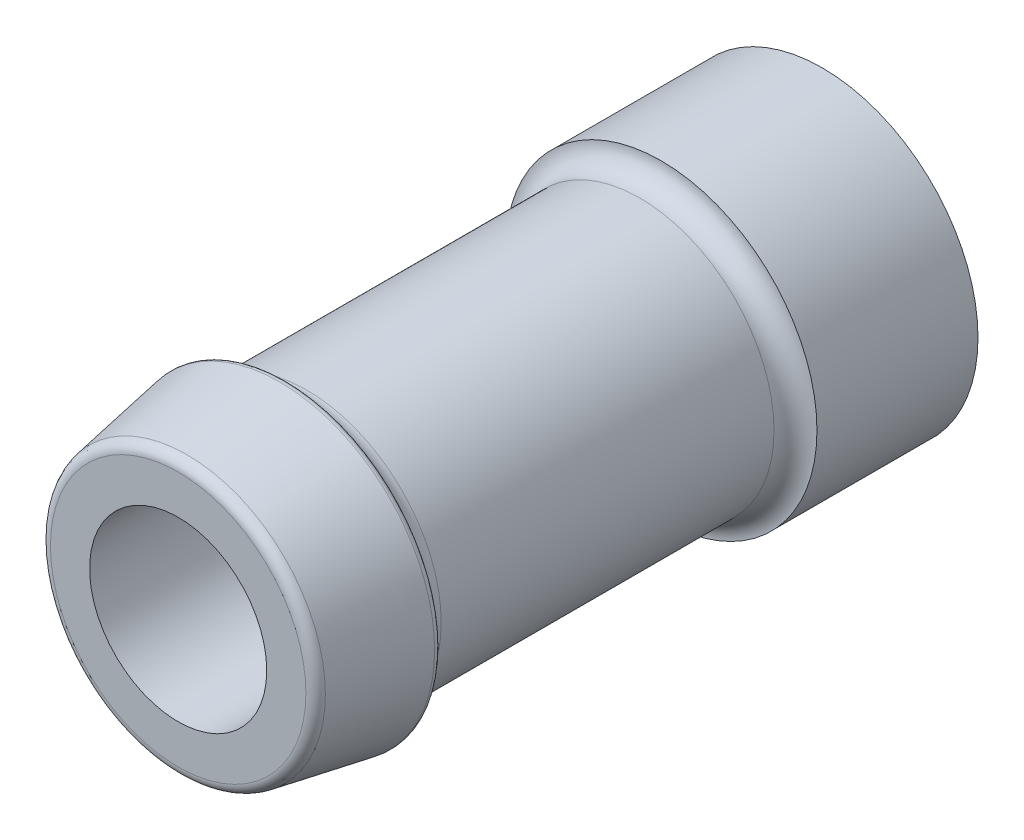
ISO-10303-21;
HEADER;
FILE_DESCRIPTION(('STEP AP214'),'2;1');
FILE_NAME('part.step','',(''),(''),'','','');
FILE_SCHEMA(('AUTOMOTIVE_DESIGN { 1 0 10303 214 1 1 1 1 }'));
ENDSEC;
DATA;
#1=APPLICATION_CONTEXT('core data for automotive mechanical design processes');
#2=APPLICATION_PROTOCOL_DEFINITION('international standard','automotive_design',2000,#1);
#3=PRODUCT_CONTEXT('',#1,'mechanical');
#4=PRODUCT('Part','Part','',(#3));
#5=PRODUCT_RELATED_PRODUCT_CATEGORY('part','',(#4));
#6=PRODUCT_DEFINITION_FORMATION('','',#4);
#7=PRODUCT_DEFINITION_CONTEXT('part definition',#1,'design');
#8=PRODUCT_DEFINITION('design','',#6,#7);
#9=PRODUCT_DEFINITION_SHAPE('','',#8);
#10=(LENGTH_UNIT() NAMED_UNIT(*) SI_UNIT(.MILLI.,.METRE.));
#11=(NAMED_UNIT(*) PLANE_ANGLE_UNIT() SI_UNIT($,.RADIAN.));
#12=(NAMED_UNIT(*) SI_UNIT($,.STERADIAN.) SOLID_ANGLE_UNIT());
#13=UNCERTAINTY_MEASURE_WITH_UNIT(LENGTH_MEASURE(1.E-05),#10,'distance_accuracy_value','');
#14=(GEOMETRIC_REPRESENTATION_CONTEXT(3) GLOBAL_UNCERTAINTY_ASSIGNED_CONTEXT((#13)) GLOBAL_UNIT_ASSIGNED_CONTEXT((#10,
#11,#12)) REPRESENTATION_CONTEXT('',''));
#15=CARTESIAN_POINT('',(0.,0.,0.));
#16=DIRECTION('',(0.,0.,1.));
#17=DIRECTION('',(1.,0.,0.));
#18=AXIS2_PLACEMENT_3D('',#15,#16,#17);
#19=CARTESIAN_POINT('',(0.,0.,30.48));
#20=DIRECTION('',(0.,0.,-1.));
#21=DIRECTION('',(-1.,0.,0.));
#22=AXIS2_PLACEMENT_3D('',#19,#20,#21);
#23=CYLINDRICAL_SURFACE('',#22,7.366);
#24=CARTESIAN_POINT('',(0.,0.,0.));
#25=DIRECTION('',(0.,0.,1.));
#26=DIRECTION('',(1.,0.,0.));
#27=AXIS2_PLACEMENT_3D('',#24,#25,#26);
#28=CIRCLE('',#27,7.366);
#29=CARTESIAN_POINT('',(-7.366,0.,0.));
#30=VERTEX_POINT('',#29);
#31=EDGE_CURVE('E71',#30,#30,#28,.T.);
#32=CARTESIAN_POINT('',(0.,0.,7.62));
#33=DIRECTION('',(0.,0.,1.));
#34=DIRECTION('',(1.,0.,0.));
#35=AXIS2_PLACEMENT_3D('',#32,#33,#34);
#36=CIRCLE('',#35,7.366);
#37=CARTESIAN_POINT('',(-7.366,0.,7.61999999999999));
#38=VERTEX_POINT('',#37);
#39=EDGE_CURVE('E72',#38,#38,#36,.T.);
#40=CARTESIAN_POINT('',(-7.366,0.,0.));
#41=CARTESIAN_POINT('',(-7.366,0.,0.0793749999999997));
#42=CARTESIAN_POINT('',(-7.366,0.,0.158749999999999));
#43=CARTESIAN_POINT('',(-7.366,0.,0.3175));
#44=CARTESIAN_POINT('',(-7.366,0.,0.396875));
#45=CARTESIAN_POINT('',(-7.366,0.,0.555625000000001));
#46=CARTESIAN_POINT('',(-7.366,0.,0.635));
#47=CARTESIAN_POINT('',(-7.366,0.,0.793749999999999));
#48=CARTESIAN_POINT('',(-7.366,0.,0.873124999999999));
#49=CARTESIAN_POINT('',(-7.366,0.,1.031875));
#50=CARTESIAN_POINT('',(-7.366,0.,1.11125));
#51=CARTESIAN_POINT('',(-7.366,0.,1.27));
#52=CARTESIAN_POINT('',(-7.366,0.,1.349375));
#53=CARTESIAN_POINT('',(-7.366,0.,1.508125));
#54=CARTESIAN_POINT('',(-7.366,0.,1.5875));
#55=CARTESIAN_POINT('',(-7.366,0.,1.74625));
#56=CARTESIAN_POINT('',(-7.366,0.,1.825625));
#57=CARTESIAN_POINT('',(-7.366,0.,1.984375));
#58=CARTESIAN_POINT('',(-7.366,0.,2.06375));
#59=CARTESIAN_POINT('',(-7.366,0.,2.2225));
#60=CARTESIAN_POINT('',(-7.366,0.,2.301875));
#61=CARTESIAN_POINT('',(-7.366,0.,2.460625));
#62=CARTESIAN_POINT('',(-7.366,0.,2.54));
#63=CARTESIAN_POINT('',(-7.366,0.,2.69875));
#64=CARTESIAN_POINT('',(-7.366,0.,2.778125));
#65=CARTESIAN_POINT('',(-7.366,0.,2.936875));
#66=CARTESIAN_POINT('',(-7.366,0.,3.01625));
#67=CARTESIAN_POINT('',(-7.366,0.,3.175));
#68=CARTESIAN_POINT('',(-7.366,0.,3.254375));
#69=CARTESIAN_POINT('',(-7.366,0.,3.413125));
#70=CARTESIAN_POINT('',(-7.366,0.,3.4925));
#71=CARTESIAN_POINT('',(-7.366,0.,3.65125));
#72=CARTESIAN_POINT('',(-7.366,0.,3.730625));
#73=CARTESIAN_POINT('',(-7.366,0.,3.889375));
#74=CARTESIAN_POINT('',(-7.366,0.,3.96875));
#75=CARTESIAN_POINT('',(-7.366,0.,4.1275));
#76=CARTESIAN_POINT('',(-7.366,0.,4.206875));
#77=CARTESIAN_POINT('',(-7.366,0.,4.365625));
#78=CARTESIAN_POINT('',(-7.366,0.,4.445));
#79=CARTESIAN_POINT('',(-7.366,0.,4.60375));
#80=CARTESIAN_POINT('',(-7.366,0.,4.683125));
#81=CARTESIAN_POINT('',(-7.366,0.,4.841875));
#82=CARTESIAN_POINT('',(-7.366,0.,4.92125));
#83=CARTESIAN_POINT('',(-7.366,0.,5.07999999999999));
#84=CARTESIAN_POINT('',(-7.366,0.,5.159375));
#85=CARTESIAN_POINT('',(-7.366,0.,5.318125));
#86=CARTESIAN_POINT('',(-7.366,0.,5.3975));
#87=CARTESIAN_POINT('',(-7.366,0.,5.55625));
#88=CARTESIAN_POINT('',(-7.366,0.,5.635625));
#89=CARTESIAN_POINT('',(-7.366,0.,5.794375));
#90=CARTESIAN_POINT('',(-7.366,0.,5.87375));
#91=CARTESIAN_POINT('',(-7.366,0.,6.0325));
#92=CARTESIAN_POINT('',(-7.366,0.,6.111875));
#93=CARTESIAN_POINT('',(-7.366,0.,6.27062499999999));
#94=CARTESIAN_POINT('',(-7.366,0.,6.34999999999999));
#95=CARTESIAN_POINT('',(-7.366,0.,6.50874999999999));
#96=CARTESIAN_POINT('',(-7.366,0.,6.588125));
#97=CARTESIAN_POINT('',(-7.366,0.,6.746875));
#98=CARTESIAN_POINT('',(-7.366,0.,6.82625));
#99=CARTESIAN_POINT('',(-7.366,0.,6.985));
#100=CARTESIAN_POINT('',(-7.366,0.,7.064375));
#101=CARTESIAN_POINT('',(-7.366,0.,7.223125));
#102=CARTESIAN_POINT('',(-7.366,0.,7.3025));
#103=CARTESIAN_POINT('',(-7.366,0.,7.46125));
#104=CARTESIAN_POINT('',(-7.366,0.,7.540625));
#105=CARTESIAN_POINT('',(-7.366,0.,7.61999999999999));
#106=B_SPLINE_CURVE_WITH_KNOTS('',3,(#40,#41,#42,#43,#44,#45,#46,#47,#48,#49,#50,#51,#52,#53,
#54,#55,#56,#57,#58,#59,#60,#61,#62,#63,#64,#65,#66,#67,#68,#69,#70,#71,#72,#73,#74,#75,#76,#77,
#78,#79,#80,#81,#82,#83,#84,#85,#86,#87,#88,#89,#90,#91,#92,#93,#94,#95,#96,#97,#98,#99,#100,
#101,#102,#103,#104,#105),.UNSPECIFIED.,.F.,.F.,(4,2,2,2,2,2,2,2,2,2,2,2,2,2,2,2,2,2,2,2,2,2,2,
2,2,2,2,2,2,2,2,2,4),(0.,0.238124999999999,0.476250000000001,0.714375,0.952499999999998,
1.190625,1.42875,1.666875,1.905,2.143125,2.38125,2.619375,2.8575,3.095625,3.33375,3.571875,3.81,
4.048125,4.28625,4.524375,4.7625,5.00062499999999,5.23875,5.476875,5.715,5.953125,6.19125,
6.42937499999999,6.6675,6.905625,7.14375,7.381875,7.61999999999999),.UNSPECIFIED.);
#107=EDGE_CURVE('BSEAM39',#30,#38,#106,.T.);
#108=ORIENTED_EDGE('',*,*,#31,.T.);
#109=ORIENTED_EDGE('',*,*,#39,.F.);
#110=ORIENTED_EDGE('',*,*,#107,.T.);
#111=ORIENTED_EDGE('',*,*,#107,.F.);
#112=EDGE_LOOP('',(#108,#110,#109,#111));
#113=FACE_BOUND('',#112,.T.);
#114=ADVANCED_FACE('F39',(#113),#23,.T.);
#115=CARTESIAN_POINT('',(0.,0.,30.48));
#116=DIRECTION('',(0.,0.,1.));
#117=DIRECTION('',(1.,0.,0.));
#118=AXIS2_PLACEMENT_3D('',#115,#116,#117);
#119=PLANE('',#118);
#120=CARTESIAN_POINT('',(0.,0.,30.48));
#121=DIRECTION('',(0.,0.,1.));
#122=DIRECTION('',(1.,0.,0.));
#123=AXIS2_PLACEMENT_3D('',#120,#121,#122);
#124=CIRCLE('',#123,6.04399632536298);
#125=CARTESIAN_POINT('',(6.04399632536298,0.,30.48));
#126=VERTEX_POINT('',#125);
#127=EDGE_CURVE('E57',#126,#126,#124,.T.);
#128=ORIENTED_EDGE('',*,*,#127,.T.);
#129=EDGE_LOOP('',(#128));
#130=FACE_BOUND('',#129,.T.);
#131=CARTESIAN_POINT('',(0.,0.,30.48));
#132=DIRECTION('',(0.,0.,1.));
#133=DIRECTION('',(1.,0.,0.));
#134=AXIS2_PLACEMENT_3D('',#131,#132,#133);
#135=CIRCLE('',#134,4.191);
#136=CARTESIAN_POINT('',(4.191,0.,30.48));
#137=VERTEX_POINT('',#136);
#138=EDGE_CURVE('E76',#137,#137,#135,.T.);
#139=ORIENTED_EDGE('',*,*,#138,.F.);
#140=EDGE_LOOP('',(#139));
#141=FACE_BOUND('',#140,.T.);
#142=ADVANCED_FACE('F98',(#130,#141),#119,.T.);
#143=CARTESIAN_POINT('',(0.,0.,0.));
#144=DIRECTION('',(0.,0.,1.));
#145=DIRECTION('',(1.,0.,0.));
#146=AXIS2_PLACEMENT_3D('',#143,#144,#145);
#147=PLANE('',#146);
#148=CARTESIAN_POINT('',(0.,0.,0.));
#149=DIRECTION('',(0.,0.,1.));
#150=DIRECTION('',(1.,0.,0.));
#151=AXIS2_PLACEMENT_3D('',#148,#149,#150);
#152=CIRCLE('',#151,4.191);
#153=CARTESIAN_POINT('',(4.191,0.,0.));
#154=VERTEX_POINT('',#153);
#155=EDGE_CURVE('E80',#154,#154,#152,.T.);
#156=ORIENTED_EDGE('',*,*,#155,.T.);
#157=EDGE_LOOP('',(#156));
#158=FACE_BOUND('',#157,.T.);
#159=ORIENTED_EDGE('',*,*,#31,.F.);
#160=EDGE_LOOP('',(#159));
#161=FACE_BOUND('',#160,.T.);
#162=ADVANCED_FACE('F88',(#158,#161),#147,.F.);
#163=CARTESIAN_POINT('',(0.,0.,0.));
#164=DIRECTION('',(0.,0.,1.));
#165=DIRECTION('',(1.,0.,0.));
#166=AXIS2_PLACEMENT_3D('',#163,#164,#165);
#167=CYLINDRICAL_SURFACE('',#166,4.191);
#168=CARTESIAN_POINT('',(4.191,0.,0.));
#169=CARTESIAN_POINT('',(4.191,0.,0.317499999999999));
#170=CARTESIAN_POINT('',(4.191,0.,0.635));
#171=CARTESIAN_POINT('',(4.191,0.,1.27));
#172=CARTESIAN_POINT('',(4.191,0.,1.5875));
#173=CARTESIAN_POINT('',(4.191,0.,2.2225));
#174=CARTESIAN_POINT('',(4.191,0.,2.54));
#175=CARTESIAN_POINT('',(4.191,0.,3.175));
#176=CARTESIAN_POINT('',(4.191,0.,3.4925));
#177=CARTESIAN_POINT('',(4.191,0.,4.1275));
#178=CARTESIAN_POINT('',(4.191,0.,4.445));
#179=CARTESIAN_POINT('',(4.191,0.,5.08));
#180=CARTESIAN_POINT('',(4.191,0.,5.3975));
#181=CARTESIAN_POINT('',(4.191,0.,6.0325));
#182=CARTESIAN_POINT('',(4.191,0.,6.35));
#183=CARTESIAN_POINT('',(4.191,0.,6.985));
#184=CARTESIAN_POINT('',(4.191,0.,7.3025));
#185=CARTESIAN_POINT('',(4.191,0.,7.9375));
#186=CARTESIAN_POINT('',(4.191,0.,8.255));
#187=CARTESIAN_POINT('',(4.191,0.,8.89));
#188=CARTESIAN_POINT('',(4.191,0.,9.2075));
#189=CARTESIAN_POINT('',(4.191,0.,9.8425));
#190=CARTESIAN_POINT('',(4.191,0.,10.16));
#191=CARTESIAN_POINT('',(4.191,0.,10.795));
#192=CARTESIAN_POINT('',(4.191,0.,11.1125));
#193=CARTESIAN_POINT('',(4.191,0.,11.7475));
#194=CARTESIAN_POINT('',(4.191,0.,12.065));
#195=CARTESIAN_POINT('',(4.191,0.,12.7));
#196=CARTESIAN_POINT('',(4.191,0.,13.0175));
#197=CARTESIAN_POINT('',(4.191,0.,13.6525));
#198=CARTESIAN_POINT('',(4.191,0.,13.97));
#199=CARTESIAN_POINT('',(4.191,0.,14.605));
#200=CARTESIAN_POINT('',(4.191,0.,14.9225));
#201=CARTESIAN_POINT('',(4.191,0.,15.5575));
#202=CARTESIAN_POINT('',(4.191,0.,15.875));
#203=CARTESIAN_POINT('',(4.191,0.,16.51));
#204=CARTESIAN_POINT('',(4.191,0.,16.8275));
#205=CARTESIAN_POINT('',(4.191,0.,17.4625));
#206=CARTESIAN_POINT('',(4.191,0.,17.78));
#207=CARTESIAN_POINT('',(4.191,0.,18.415));
#208=CARTESIAN_POINT('',(4.191,0.,18.7325));
#209=CARTESIAN_POINT('',(4.191,0.,19.3675));
#210=CARTESIAN_POINT('',(4.191,0.,19.685));
#211=CARTESIAN_POINT('',(4.191,0.,20.32));
#212=CARTESIAN_POINT('',(4.191,0.,20.6375));
#213=CARTESIAN_POINT('',(4.191,0.,21.2725));
#214=CARTESIAN_POINT('',(4.191,0.,21.59));
#215=CARTESIAN_POINT('',(4.191,0.,22.225));
#216=CARTESIAN_POINT('',(4.191,0.,22.5425));
#217=CARTESIAN_POINT('',(4.191,0.,23.1775));
#218=CARTESIAN_POINT('',(4.191,0.,23.495));
#219=CARTESIAN_POINT('',(4.191,0.,24.13));
#220=CARTESIAN_POINT('',(4.191,0.,24.4475));
#221=CARTESIAN_POINT('',(4.191,0.,25.0825));
#222=CARTESIAN_POINT('',(4.191,0.,25.4));
#223=CARTESIAN_POINT('',(4.191,0.,26.035));
#224=CARTESIAN_POINT('',(4.191,0.,26.3525));
#225=CARTESIAN_POINT('',(4.191,0.,26.9875));
#226=CARTESIAN_POINT('',(4.191,0.,27.305));
#227=CARTESIAN_POINT('',(4.191,0.,27.94));
#228=CARTESIAN_POINT('',(4.191,0.,28.2575));
#229=CARTESIAN_POINT('',(4.191,0.,28.8925));
#230=CARTESIAN_POINT('',(4.191,0.,29.21));
#231=CARTESIAN_POINT('',(4.191,0.,29.845));
#232=CARTESIAN_POINT('',(4.191,0.,30.1625));
#233=CARTESIAN_POINT('',(4.191,0.,30.48));
#234=B_SPLINE_CURVE_WITH_KNOTS('',3,(#168,#169,#170,#171,#172,#173,#174,#175,#176,#177,#178,
#179,#180,#181,#182,#183,#184,#185,#186,#187,#188,#189,#190,#191,#192,#193,#194,#195,#196,#197,
#198,#199,#200,#201,#202,#203,#204,#205,#206,#207,#208,#209,#210,#211,#212,#213,#214,#215,#216,
#217,#218,#219,#220,#221,#222,#223,#224,#225,#226,#227,#228,#229,#230,#231,#232,#233),
.UNSPECIFIED.,.F.,.F.,(4,2,2,2,2,2,2,2,2,2,2,2,2,2,2,2,2,2,2,2,2,2,2,2,2,2,2,2,2,2,2,2,4),(0.,
0.9525,1.905,2.8575,3.81,4.7625,5.715,6.6675,7.62,8.5725,9.525,10.4775,11.43,12.3825,13.335,
14.2875,15.24,16.1925,17.145,18.0975,19.05,20.0025,20.955,21.9075,22.86,23.8125,24.765,25.7175,
26.67,27.6225,28.575,29.5275,30.48),.UNSPECIFIED.);
#235=EDGE_CURVE('BSEAM91',#154,#137,#234,.T.);
#236=ORIENTED_EDGE('',*,*,#155,.F.);
#237=ORIENTED_EDGE('',*,*,#138,.T.);
#238=ORIENTED_EDGE('',*,*,#235,.T.);
#239=ORIENTED_EDGE('',*,*,#235,.F.);
#240=EDGE_LOOP('',(#236,#238,#237,#239));
#241=FACE_BOUND('',#240,.T.);
#242=ADVANCED_FACE('F91',(#241),#167,.F.);
#243=CARTESIAN_POINT('',(0.,0.,7.62));
#244=DIRECTION('',(0.,0.,1.));
#245=DIRECTION('',(1.,0.,0.));
#246=AXIS2_PLACEMENT_3D('',#243,#244,#245);
#247=CYLINDRICAL_SURFACE('',#246,6.35);
#248=CARTESIAN_POINT('',(0.,0.,24.384));
#249=DIRECTION('',(0.,0.,1.));
#250=DIRECTION('',(1.,0.,0.));
#251=AXIS2_PLACEMENT_3D('',#248,#249,#250);
#252=CIRCLE('',#251,6.35);
#253=CARTESIAN_POINT('',(6.35,0.,24.384));
#254=VERTEX_POINT('',#253);
#255=EDGE_CURVE('E63',#254,#254,#252,.F.);
#256=ORIENTED_EDGE('',*,*,#255,.T.);
#257=EDGE_LOOP('',(#256));
#258=FACE_BOUND('',#257,.T.);
#259=CARTESIAN_POINT('',(0.,0.,8.636));
#260=DIRECTION('',(0.,0.,1.));
#261=DIRECTION('',(1.,0.,0.));
#262=AXIS2_PLACEMENT_3D('',#259,#260,#261);
#263=CIRCLE('',#262,6.35);
#264=CARTESIAN_POINT('',(6.35,0.,8.636));
#265=VERTEX_POINT('',#264);
#266=EDGE_CURVE('E67',#265,#265,#263,.T.);
#267=ORIENTED_EDGE('',*,*,#266,.T.);
#268=EDGE_LOOP('',(#267));
#269=FACE_BOUND('',#268,.T.);
#270=ADVANCED_FACE('F94',(#258,#269),#247,.T.);
#271=CARTESIAN_POINT('',(0.,0.,8.636));
#272=DIRECTION('',(0.,0.,1.));
#273=DIRECTION('',(1.,0.,0.));
#274=AXIS2_PLACEMENT_3D('',#271,#272,#273);
#275=TOROIDAL_SURFACE('',#274,7.366,1.016);
#276=ORIENTED_EDGE('',*,*,#39,.T.);
#277=EDGE_LOOP('',(#276));
#278=FACE_BOUND('',#277,.T.);
#279=ORIENTED_EDGE('',*,*,#266,.F.);
#280=EDGE_LOOP('',(#279));
#281=FACE_BOUND('',#280,.T.);
#282=ADVANCED_FACE('F111',(#278,#281),#275,.F.);
#283=CARTESIAN_POINT('',(0.,0.,24.384));
#284=DIRECTION('',(0.,0.,1.));
#285=DIRECTION('',(1.,0.,0.));
#286=AXIS2_PLACEMENT_3D('',#283,#284,#285);
#287=TOROIDAL_SURFACE('',#286,7.366,1.016);
#288=CARTESIAN_POINT('',(0.,0.,25.3719200164029));
#289=DIRECTION('',(0.,0.,-1.));
#290=DIRECTION('',(-1.,0.,0.));
#291=AXIS2_PLACEMENT_3D('',#288,#289,#290);
#292=CIRCLE('',#291,7.12878692871089);
#293=CARTESIAN_POINT('',(-7.12878692871089,0.,25.3719200164029));
#294=VERTEX_POINT('',#293);
#295=EDGE_CURVE('E10',#294,#294,#292,.T.);
#296=ORIENTED_EDGE('',*,*,#295,.T.);
#297=EDGE_LOOP('',(#296));
#298=FACE_BOUND('',#297,.T.);
#299=ORIENTED_EDGE('',*,*,#255,.F.);
#300=EDGE_LOOP('',(#299));
#301=FACE_BOUND('',#300,.T.);
#302=ADVANCED_FACE('F114',(#298,#301),#287,.F.);
#303=CARTESIAN_POINT('',(0.,0.,30.48));
#304=DIRECTION('',(0.,0.,-1.));
#305=DIRECTION('',(-1.,0.,0.));
#306=AXIS2_PLACEMENT_3D('',#303,#304,#305);
#307=CONICAL_SURFACE('',#306,6.47025893800104,0.17453292519943);
#308=CARTESIAN_POINT('',(0.,0.,25.6630066576311));
#309=DIRECTION('',(0.,0.,-1.));
#310=DIRECTION('',(-1.,0.,0.));
#311=AXIS2_PLACEMENT_3D('',#308,#309,#310);
#312=CIRCLE('',#311,7.31962483015372);
#313=CARTESIAN_POINT('',(-7.31962483015372,0.,25.6630066576311));
#314=VERTEX_POINT('',#313);
#315=EDGE_CURVE('E47',#314,#314,#312,.F.);
#316=CARTESIAN_POINT('',(0.,0.,30.0602132742548));
#317=DIRECTION('',(0.,0.,1.));
#318=DIRECTION('',(1.,0.,0.));
#319=AXIS2_PLACEMENT_3D('',#316,#317,#318);
#320=CIRCLE('',#319,6.54427866389318);
#321=CARTESIAN_POINT('',(-6.54427866389318,0.,30.0602132742548));
#322=VERTEX_POINT('',#321);
#323=EDGE_CURVE('E52',#322,#322,#320,.F.);
#324=CARTESIAN_POINT('',(-7.31962483015372,0.,25.6630066576311));
#325=CARTESIAN_POINT('',(-7.31154830758851,0.,25.7088108932209));
#326=CARTESIAN_POINT('',(-7.30347178502329,0.,25.7546151288107));
#327=CARTESIAN_POINT('',(-7.28731873989286,0.,25.8462235999904));
#328=CARTESIAN_POINT('',(-7.27924221732765,0.,25.8920278355802));
#329=CARTESIAN_POINT('',(-7.26308917219722,0.,25.9836363067599));
#330=CARTESIAN_POINT('',(-7.25501264963201,0.,26.0294405423497));
#331=CARTESIAN_POINT('',(-7.23885960450158,0.,26.1210490135294));
#332=CARTESIAN_POINT('',(-7.23078308193637,0.,26.1668532491192));
#333=CARTESIAN_POINT('',(-7.21463003680594,0.,26.2584617202989));
#334=CARTESIAN_POINT('',(-7.20655351424072,0.,26.3042659558887));
#335=CARTESIAN_POINT('',(-7.19040046911029,0.,26.3958744270684));
#336=CARTESIAN_POINT('',(-7.18232394654508,0.,26.4416786626582));
#337=CARTESIAN_POINT('',(-7.16617090141466,0.,26.5332871338379));
#338=CARTESIAN_POINT('',(-7.15809437884944,0.,26.5790913694277));
#339=CARTESIAN_POINT('',(-7.14194133371901,0.,26.6706998406073));
#340=CARTESIAN_POINT('',(-7.1338648111538,0.,26.7165040761972));
#341=CARTESIAN_POINT('',(-7.11771176602337,0.,26.8081125473768));
#342=CARTESIAN_POINT('',(-7.10963524345816,0.,26.8539167829667));
#343=CARTESIAN_POINT('',(-7.09348219832773,0.,26.9455252541463));
#344=CARTESIAN_POINT('',(-7.08540567576252,0.,26.9913294897362));
#345=CARTESIAN_POINT('',(-7.06925263063209,0.,27.0829379609158));
#346=CARTESIAN_POINT('',(-7.06117610806687,0.,27.1287421965056));
#347=CARTESIAN_POINT('',(-7.04502306293644,0.,27.2203506676853));
#348=CARTESIAN_POINT('',(-7.03694654037123,0.,27.2661549032751));
#349=CARTESIAN_POINT('',(-7.02079349524081,0.,27.3577633744548));
#350=CARTESIAN_POINT('',(-7.01271697267559,0.,27.4035676100446));
#351=CARTESIAN_POINT('',(-6.99656392754516,0.,27.4951760812243));
#352=CARTESIAN_POINT('',(-6.98848740497995,0.,27.5409803168141));
#353=CARTESIAN_POINT('',(-6.97233435984952,0.,27.6325887879938));
#354=CARTESIAN_POINT('',(-6.96425783728431,0.,27.6783930235836));
#355=CARTESIAN_POINT('',(-6.94810479215388,0.,27.7700014947633));
#356=CARTESIAN_POINT('',(-6.94002826958867,0.,27.8158057303531));
#357=CARTESIAN_POINT('',(-6.92387522445824,0.,27.9074142015328));
#358=CARTESIAN_POINT('',(-6.91579870189302,0.,27.9532184371226));
#359=CARTESIAN_POINT('',(-6.8996456567626,0.,28.0448269083023));
#360=CARTESIAN_POINT('',(-6.89156913419738,0.,28.0906311438921));
#361=CARTESIAN_POINT('',(-6.87541608906695,0.,28.1822396150718));
#362=CARTESIAN_POINT('',(-6.86733956650174,0.,28.2280438506616));
#363=CARTESIAN_POINT('',(-6.85118652137131,0.,28.3196523218412));
#364=CARTESIAN_POINT('',(-6.8431099988061,0.,28.3654565574311));
#365=CARTESIAN_POINT('',(-6.82695695367567,0.,28.4570650286107));
#366=CARTESIAN_POINT('',(-6.81888043111046,0.,28.5028692642006));
#367=CARTESIAN_POINT('',(-6.80272738598003,0.,28.5944777353802));
#368=CARTESIAN_POINT('',(-6.79465086341482,0.,28.6402819709701));
#369=CARTESIAN_POINT('',(-6.77849781828439,0.,28.7318904421497));
#370=CARTESIAN_POINT('',(-6.77042129571917,0.,28.7776946777395));
#371=CARTESIAN_POINT('',(-6.75426825058875,0.,28.8693031489192));
#372=CARTESIAN_POINT('',(-6.74619172802353,0.,28.915107384509));
#373=CARTESIAN_POINT('',(-6.7300386828931,0.,29.0067158556887));
#374=CARTESIAN_POINT('',(-6.72196216032789,0.,29.0525200912785));
#375=CARTESIAN_POINT('',(-6.70580911519746,0.,29.1441285624582));
#376=CARTESIAN_POINT('',(-6.69773259263225,0.,29.189932798048));
#377=CARTESIAN_POINT('',(-6.68157954750182,0.,29.2815412692277));
#378=CARTESIAN_POINT('',(-6.67350302493661,0.,29.3273455048175));
#379=CARTESIAN_POINT('',(-6.65734997980618,0.,29.4189539759972));
#380=CARTESIAN_POINT('',(-6.64927345724097,0.,29.464758211587));
#381=CARTESIAN_POINT('',(-6.63312041211054,0.,29.5563666827667));
#382=CARTESIAN_POINT('',(-6.62504388954532,0.,29.6021709183565));
#383=CARTESIAN_POINT('',(-6.6088908444149,0.,29.6937793895362));
#384=CARTESIAN_POINT('',(-6.60081432184968,0.,29.739583625126));
#385=CARTESIAN_POINT('',(-6.58466127671925,0.,29.8311920963056));
#386=CARTESIAN_POINT('',(-6.57658475415404,0.,29.8769963318955));
#387=CARTESIAN_POINT('',(-6.56043170902361,0.,29.9686048030751));
#388=CARTESIAN_POINT('',(-6.5523551864584,0.,30.014409038665));
#389=CARTESIAN_POINT('',(-6.54427866389318,0.,30.0602132742548));
#390=B_SPLINE_CURVE_WITH_KNOTS('',3,(#324,#325,#326,#327,#328,#329,#330,#331,#332,#333,#334,
#335,#336,#337,#338,#339,#340,#341,#342,#343,#344,#345,#346,#347,#348,#349,#350,#351,#352,#353,
#354,#355,#356,#357,#358,#359,#360,#361,#362,#363,#364,#365,#366,#367,#368,#369,#370,#371,#372,
#373,#374,#375,#376,#377,#378,#379,#380,#381,#382,#383,#384,#385,#386,#387,#388,#389),
.UNSPECIFIED.,.F.,.F.,(4,2,2,2,2,2,2,2,2,2,2,2,2,2,2,2,2,2,2,2,2,2,2,2,2,2,2,2,2,2,2,2,4),(0.,
0.139532519264996,0.279065038529989,0.418597557794985,0.558130077059978,0.69766259632497,
0.837195115589966,0.976727634854959,1.11626015411995,1.25579267338495,1.39532519264994,
1.53485771191493,1.67439023117993,1.81392275044492,1.95345526970992,2.09298778897491,
2.2325203082399,2.3720528275049,2.51158534676989,2.65111786603489,2.79065038529988,
2.93018290456487,3.06971542382987,3.20924794309486,3.34878046235985,3.48831298162485,
3.62784550088984,3.76737802015484,3.90691053941983,4.04644305868483,4.18597557794982,
4.32550809721481,4.46504061647981),.UNSPECIFIED.);
#391=EDGE_CURVE('BSEAM118',#314,#322,#390,.T.);
#392=ORIENTED_EDGE('',*,*,#315,.T.);
#393=ORIENTED_EDGE('',*,*,#323,.T.);
#394=ORIENTED_EDGE('',*,*,#391,.T.);
#395=ORIENTED_EDGE('',*,*,#391,.F.);
#396=EDGE_LOOP('',(#392,#394,#393,#395));
#397=FACE_BOUND('',#396,.T.);
#398=ADVANCED_FACE('F118',(#397),#307,.T.);
#399=CARTESIAN_POINT('',(0.,0.,29.972));
#400=DIRECTION('',(0.,0.,1.));
#401=DIRECTION('',(1.,0.,0.));
#402=AXIS2_PLACEMENT_3D('',#399,#400,#401);
#403=TOROIDAL_SURFACE('',#402,6.04399632536298,0.508);
#404=ORIENTED_EDGE('',*,*,#323,.F.);
#405=EDGE_LOOP('',(#404));
#406=FACE_BOUND('',#405,.T.);
#407=ORIENTED_EDGE('',*,*,#127,.F.);
#408=EDGE_LOOP('',(#407));
#409=FACE_BOUND('',#408,.T.);
#410=ADVANCED_FACE('F123',(#406,#409),#403,.T.);
#411=CARTESIAN_POINT('',(0.,0.,25.6189000205037));
#412=DIRECTION('',(0.,0.,-1.));
#413=DIRECTION('',(-1.,0.,0.));
#414=AXIS2_PLACEMENT_3D('',#411,#412,#413);
#415=TOROIDAL_SURFACE('',#414,7.06948366088862,0.254);
#416=ORIENTED_EDGE('',*,*,#295,.F.);
#417=EDGE_LOOP('',(#416));
#418=FACE_BOUND('',#417,.T.);
#419=ORIENTED_EDGE('',*,*,#315,.F.);
#420=EDGE_LOOP('',(#419));
#421=FACE_BOUND('',#420,.T.);
#422=ADVANCED_FACE('F41',(#418,#421),#415,.T.);
#423=CLOSED_SHELL('',(#114,#142,#162,#242,#270,#282,#302,#398,#410,#422));
#424=MANIFOLD_SOLID_BREP('B2',#423);
#425=ADVANCED_BREP_SHAPE_REPRESENTATION('',(#18,#424),#14);
#426=SHAPE_DEFINITION_REPRESENTATION(#9,#425);
ENDSEC;
END-ISO-10303-21;
